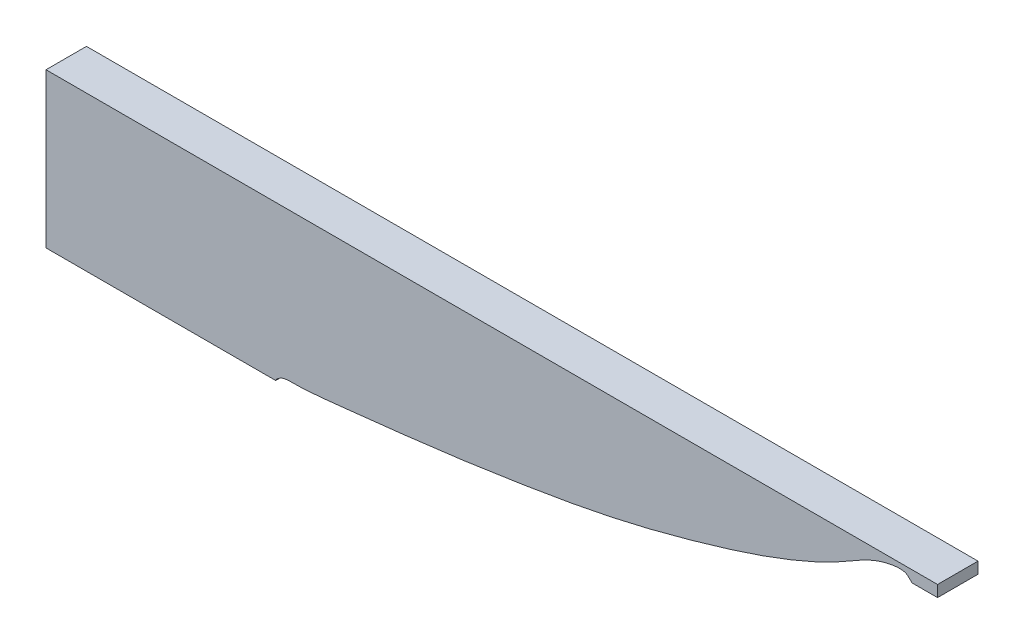
ISO-10303-21;
HEADER;
FILE_DESCRIPTION(('STEP AP214'),'2;1');
FILE_NAME('part.step','',(''),(''),'','','');
FILE_SCHEMA(('AUTOMOTIVE_DESIGN { 1 0 10303 214 1 1 1 1 }'));
ENDSEC;
DATA;
#1=APPLICATION_CONTEXT('core data for automotive mechanical design processes');
#2=APPLICATION_PROTOCOL_DEFINITION('international standard','automotive_design',2000,#1);
#3=PRODUCT_CONTEXT('',#1,'mechanical');
#4=PRODUCT('Part','Part','',(#3));
#5=PRODUCT_RELATED_PRODUCT_CATEGORY('part','',(#4));
#6=PRODUCT_DEFINITION_FORMATION('','',#4);
#7=PRODUCT_DEFINITION_CONTEXT('part definition',#1,'design');
#8=PRODUCT_DEFINITION('design','',#6,#7);
#9=PRODUCT_DEFINITION_SHAPE('','',#8);
#10=(LENGTH_UNIT() NAMED_UNIT(*) SI_UNIT(.MILLI.,.METRE.));
#11=(NAMED_UNIT(*) PLANE_ANGLE_UNIT() SI_UNIT($,.RADIAN.));
#12=(NAMED_UNIT(*) SI_UNIT($,.STERADIAN.) SOLID_ANGLE_UNIT());
#13=UNCERTAINTY_MEASURE_WITH_UNIT(LENGTH_MEASURE(1.E-05),#10,'distance_accuracy_value','');
#14=(GEOMETRIC_REPRESENTATION_CONTEXT(3) GLOBAL_UNCERTAINTY_ASSIGNED_CONTEXT((#13)) GLOBAL_UNIT_ASSIGNED_CONTEXT((#10,
#11,#12)) REPRESENTATION_CONTEXT('',''));
#15=CARTESIAN_POINT('',(0.,0.,0.));
#16=DIRECTION('',(0.,0.,1.));
#17=DIRECTION('',(1.,0.,0.));
#18=AXIS2_PLACEMENT_3D('',#15,#16,#17);
#19=CARTESIAN_POINT('',(78.7770014948803,2.25600000000005,356.));
#20=DIRECTION('',(-1.,0.,0.));
#21=DIRECTION('',(0.,0.,1.));
#22=AXIS2_PLACEMENT_3D('',#19,#20,#21);
#23=PLANE('',#22);
#24=DIRECTION('',(0.,1.,0.));
#25=VECTOR('',#24,1.);
#26=CARTESIAN_POINT('',(78.7770014948803,2.25600000000005,348.));
#27=LINE('',#26,#25);
#28=CARTESIAN_POINT('',(78.7770014948803,0.,348.));
#29=VERTEX_POINT('',#28);
#30=CARTESIAN_POINT('',(78.7770014948803,2.25600000000005,348.));
#31=VERTEX_POINT('',#30);
#32=EDGE_CURVE('E151',#29,#31,#27,.T.);
#33=ORIENTED_EDGE('',*,*,#32,.T.);
#34=DIRECTION('',(0.,0.,-1.));
#35=VECTOR('',#34,1.);
#36=CARTESIAN_POINT('',(78.7770014948803,2.25600000000005,356.));
#37=LINE('',#36,#35);
#38=CARTESIAN_POINT('',(78.7770014948803,2.25600000000005,356.));
#39=VERTEX_POINT('',#38);
#40=EDGE_CURVE('E11',#39,#31,#37,.T.);
#41=ORIENTED_EDGE('',*,*,#40,.F.);
#42=DIRECTION('',(0.,1.,0.));
#43=VECTOR('',#42,1.);
#44=CARTESIAN_POINT('',(78.7770014948803,2.25600000000005,356.));
#45=LINE('',#44,#43);
#46=CARTESIAN_POINT('',(78.7770014948803,0.,356.));
#47=VERTEX_POINT('',#46);
#48=EDGE_CURVE('E205',#47,#39,#45,.T.);
#49=ORIENTED_EDGE('',*,*,#48,.F.);
#50=DIRECTION('',(0.,0.,-1.));
#51=VECTOR('',#50,1.);
#52=CARTESIAN_POINT('',(78.7770014948803,0.,356.));
#53=LINE('',#52,#51);
#54=EDGE_CURVE('E160',#47,#29,#53,.T.);
#55=ORIENTED_EDGE('',*,*,#54,.T.);
#56=EDGE_LOOP('',(#33,#41,#49,#55));
#57=FACE_BOUND('',#56,.T.);
#58=ADVANCED_FACE('F30',(#57),#23,.F.);
#59=CARTESIAN_POINT('',(78.7770014948803,2.25600000000005,356.));
#60=DIRECTION('',(0.,-1.,0.));
#61=DIRECTION('',(1.,0.,0.));
#62=AXIS2_PLACEMENT_3D('',#59,#60,#61);
#63=PLANE('',#62);
#64=DIRECTION('',(-1.,0.,0.));
#65=VECTOR('',#64,1.);
#66=CARTESIAN_POINT('',(78.7770014948803,2.25600000000005,348.));
#67=LINE('',#66,#65);
#68=CARTESIAN_POINT('',(-97.4926258895072,2.25600000000002,348.));
#69=VERTEX_POINT('',#68);
#70=EDGE_CURVE('E157',#31,#69,#67,.T.);
#71=ORIENTED_EDGE('',*,*,#70,.T.);
#72=DIRECTION('',(0.,0.,-1.));
#73=VECTOR('',#72,1.);
#74=CARTESIAN_POINT('',(-97.4926258895072,2.25600000000002,356.));
#75=LINE('',#74,#73);
#76=CARTESIAN_POINT('',(-97.4926258895072,2.25600000000002,356.));
#77=VERTEX_POINT('',#76);
#78=EDGE_CURVE('E39',#77,#69,#75,.T.);
#79=ORIENTED_EDGE('',*,*,#78,.F.);
#80=DIRECTION('',(-1.,0.,0.));
#81=VECTOR('',#80,1.);
#82=CARTESIAN_POINT('',(78.7770014948803,2.25600000000005,356.));
#83=LINE('',#82,#81);
#84=EDGE_CURVE('E86',#39,#77,#83,.T.);
#85=ORIENTED_EDGE('',*,*,#84,.F.);
#86=ORIENTED_EDGE('',*,*,#40,.T.);
#87=EDGE_LOOP('',(#71,#79,#85,#86));
#88=FACE_BOUND('',#87,.T.);
#89=ADVANCED_FACE('F211',(#88),#63,.F.);
#90=CARTESIAN_POINT('',(-97.4926258895072,-28.2587762088678,356.));
#91=DIRECTION('',(1.,0.,0.));
#92=DIRECTION('',(0.,1.,0.));
#93=AXIS2_PLACEMENT_3D('',#90,#91,#92);
#94=PLANE('',#93);
#95=DIRECTION('',(0.,-1.,0.));
#96=VECTOR('',#95,1.);
#97=CARTESIAN_POINT('',(-97.4926258895072,-28.2587762088678,348.));
#98=LINE('',#97,#96);
#99=CARTESIAN_POINT('',(-97.4926258895072,-28.2587762088678,348.));
#100=VERTEX_POINT('',#99);
#101=EDGE_CURVE('E159',#69,#100,#98,.T.);
#102=ORIENTED_EDGE('',*,*,#101,.T.);
#103=DIRECTION('',(0.,0.,-1.));
#104=VECTOR('',#103,1.);
#105=CARTESIAN_POINT('',(-97.4926258895072,-28.2587762088678,356.));
#106=LINE('',#105,#104);
#107=CARTESIAN_POINT('',(-97.4926258895072,-28.2587762088678,356.));
#108=VERTEX_POINT('',#107);
#109=EDGE_CURVE('E113',#108,#100,#106,.T.);
#110=ORIENTED_EDGE('',*,*,#109,.F.);
#111=DIRECTION('',(0.,-1.,0.));
#112=VECTOR('',#111,1.);
#113=CARTESIAN_POINT('',(-97.4926258895072,-28.2587762088678,356.));
#114=LINE('',#113,#112);
#115=EDGE_CURVE('E101',#77,#108,#114,.T.);
#116=ORIENTED_EDGE('',*,*,#115,.F.);
#117=ORIENTED_EDGE('',*,*,#78,.T.);
#118=EDGE_LOOP('',(#102,#110,#116,#117));
#119=FACE_BOUND('',#118,.T.);
#120=ADVANCED_FACE('F208',(#119),#94,.F.);
#121=CARTESIAN_POINT('',(-97.4926258895072,-28.2587762088678,356.));
#122=CARTESIAN_POINT('',(-82.3550295612493,-28.2574203477883,356.));
#123=CARTESIAN_POINT('',(-67.2174332868805,-28.2554506830638,356.));
#124=CARTESIAN_POINT('',(-52.0798370634807,-28.2532117188545,356.));
#125=B_SPLINE_CURVE_WITH_KNOTS('',3,(#121,#122,#123,#124),.UNSPECIFIED.,.F.,.F.,(4,4),(0.,1.),.UNSPECIFIED.);
#126=DIRECTION('',(0.,0.,-1.));
#127=VECTOR('',#126,1.);
#128=SURFACE_OF_LINEAR_EXTRUSION('',#125,#127);
#129=CARTESIAN_POINT('',(-97.4926258895072,-28.2587762088678,348.));
#130=CARTESIAN_POINT('',(-82.3550295612493,-28.2574203477883,348.));
#131=CARTESIAN_POINT('',(-67.2174332868805,-28.2554506830638,348.));
#132=CARTESIAN_POINT('',(-52.0798370634807,-28.2532117188545,348.));
#133=B_SPLINE_CURVE_WITH_KNOTS('',3,(#129,#130,#131,#132),.UNSPECIFIED.,.F.,.F.,(4,4),(0.,1.),.UNSPECIFIED.);
#134=CARTESIAN_POINT('',(-52.0798370634807,-28.2532117188545,348.));
#135=VERTEX_POINT('',#134);
#136=EDGE_CURVE('E111',#100,#135,#133,.T.);
#137=ORIENTED_EDGE('',*,*,#136,.T.);
#138=DIRECTION('',(0.,0.,-1.));
#139=VECTOR('',#138,1.);
#140=CARTESIAN_POINT('',(-52.0798370634807,-28.2532117188545,356.));
#141=LINE('',#140,#139);
#142=CARTESIAN_POINT('',(-52.0798370634807,-28.2532117188545,356.));
#143=VERTEX_POINT('',#142);
#144=EDGE_CURVE('E108',#143,#135,#141,.T.);
#145=ORIENTED_EDGE('',*,*,#144,.F.);
#146=CARTESIAN_POINT('',(-52.0798370634807,-28.2532117188545,356.));
#147=CARTESIAN_POINT('',(-67.2174332868805,-28.2554506830638,356.));
#148=CARTESIAN_POINT('',(-82.3550295612493,-28.2574203477883,356.));
#149=CARTESIAN_POINT('',(-97.4926258895072,-28.2587762088678,356.));
#150=B_SPLINE_CURVE_WITH_KNOTS('',3,(#146,#147,#148,#149),.UNSPECIFIED.,.F.,.F.,(4,4),(0.,1.),.UNSPECIFIED.);
#151=EDGE_CURVE('E93',#108,#143,#150,.F.);
#152=ORIENTED_EDGE('',*,*,#151,.F.);
#153=ORIENTED_EDGE('',*,*,#109,.T.);
#154=EDGE_LOOP('',(#137,#145,#152,#153));
#155=FACE_BOUND('',#154,.T.);
#156=ADVANCED_FACE('F109',(#155),#128,.F.);
#157=CARTESIAN_POINT('',(-52.0798370634807,-28.2532117188545,356.));
#158=CARTESIAN_POINT('',(-52.0592766041661,-28.1645784945812,356.));
#159=CARTESIAN_POINT('',(-52.0145158030634,-28.0849926197674,356.));
#160=CARTESIAN_POINT('',(-51.9048778997584,-27.9425754383136,356.));
#161=CARTESIAN_POINT('',(-51.8420430580992,-27.8782136494394,356.));
#162=CARTESIAN_POINT('',(-51.6425276326001,-27.6958258431196,356.));
#163=CARTESIAN_POINT('',(-51.4980456727508,-27.5877845221663,356.));
#164=CARTESIAN_POINT('',(-51.1978596372491,-27.3900015534943,356.));
#165=CARTESIAN_POINT('',(-51.038649938862,-27.30350026196,356.));
#166=CARTESIAN_POINT('',(-50.7072465959637,-27.1693018670893,356.));
#167=CARTESIAN_POINT('',(-50.5401456492571,-27.1212028721314,356.));
#168=CARTESIAN_POINT('',(-50.036232257222,-27.0123535339671,356.));
#169=CARTESIAN_POINT('',(-49.6970222178277,-26.9841591674836,356.));
#170=CARTESIAN_POINT('',(-49.0166834643668,-26.9538233551747,356.));
#171=CARTESIAN_POINT('',(-48.6753298390258,-26.9547358901385,356.));
#172=CARTESIAN_POINT('',(-47.9924650418816,-26.958700220849,356.));
#173=CARTESIAN_POINT('',(-47.6511240939378,-26.9594406144764,356.));
#174=CARTESIAN_POINT('',(-46.9695342381426,-26.9460930234256,356.));
#175=CARTESIAN_POINT('',(-46.629157975807,-26.9337343346613,356.));
#176=CARTESIAN_POINT('',(-45.6091308773047,-26.8816988781144,356.));
#177=CARTESIAN_POINT('',(-44.9305647912852,-26.8260860066659,356.));
#178=CARTESIAN_POINT('',(-43.5751997232413,-26.697534032535,356.));
#179=CARTESIAN_POINT('',(-42.8981749418611,-26.6268608864918,356.));
#180=CARTESIAN_POINT('',(-41.5439567574236,-26.4871545721202,356.));
#181=CARTESIAN_POINT('',(-40.8669194490542,-26.4166032608464,356.));
#182=CARTESIAN_POINT('',(-38.8362254847579,-26.2008843311705,356.));
#183=CARTESIAN_POINT('',(-37.4829388155762,-26.0521390424067,356.));
#184=CARTESIAN_POINT('',(-30.7163400425703,-25.310394796677,356.));
#185=CARTESIAN_POINT('',(-25.3034163748986,-24.7114436640146,356.));
#186=CARTESIAN_POINT('',(-17.1995570163137,-23.6861760007202,356.));
#187=CARTESIAN_POINT('',(-14.5010484010931,-23.3228641025236,356.));
#188=CARTESIAN_POINT('',(-9.11090947916087,-22.5513642563571,356.));
#189=CARTESIAN_POINT('',(-6.4189927055765,-22.1440986172336,356.));
#190=CARTESIAN_POINT('',(-1.04032048968618,-21.2943435046088,356.));
#191=CARTESIAN_POINT('',(1.64652824247117,-20.8527741141081,356.));
#192=CARTESIAN_POINT('',(7.00906511111329,-19.9115816682843,356.));
#193=CARTESIAN_POINT('',(9.68485143297551,-19.4112778093873,356.));
#194=CARTESIAN_POINT('',(15.01901194664,-18.3163135410075,356.));
#195=CARTESIAN_POINT('',(17.6767521154746,-17.7200985941471,356.));
#196=CARTESIAN_POINT('',(22.9671578000031,-16.4364222059472,356.));
#197=CARTESIAN_POINT('',(25.601300046947,-15.7506424914263,356.));
#198=CARTESIAN_POINT('',(30.8527854245381,-14.312343552401,356.));
#199=CARTESIAN_POINT('',(33.4701427990933,-13.5597340982063,356.));
#200=CARTESIAN_POINT('',(38.6793515379877,-11.972971220532,356.));
#201=CARTESIAN_POINT('',(41.2723631270859,-11.1401476965787,356.));
#202=CARTESIAN_POINT('',(45.1290333962427,-9.79731807194106,356.));
#203=CARTESIAN_POINT('',(46.4097857397881,-9.33327046378534,356.));
#204=CARTESIAN_POINT('',(48.9527112595196,-8.36364321241708,356.));
#205=CARTESIAN_POINT('',(50.2142933620074,-7.85750451206132,356.));
#206=CARTESIAN_POINT('',(52.7184916323724,-6.80429360294811,356.));
#207=CARTESIAN_POINT('',(53.9614013071833,-6.2578548598642,356.));
#208=CARTESIAN_POINT('',(56.4218559290244,-5.11023357545852,356.));
#209=CARTESIAN_POINT('',(57.6390705514613,-4.50833810620645,356.));
#210=CARTESIAN_POINT('',(59.4364546094969,-3.54411843739262,356.));
#211=CARTESIAN_POINT('',(60.0310197207187,-3.2128639172937,356.));
#212=CARTESIAN_POINT('',(61.2153076362572,-2.53990389672216,356.));
#213=CARTESIAN_POINT('',(61.8042741280015,-2.19654755242903,356.));
#214=CARTESIAN_POINT('',(63.5760527594509,-1.17714130497712,356.));
#215=CARTESIAN_POINT('',(64.7649318279982,-0.514440223075028,356.));
#216=CARTESIAN_POINT('',(66.6428210226451,0.2718290945534,356.));
#217=CARTESIAN_POINT('',(67.2851425403943,0.497977492711653,356.));
#218=CARTESIAN_POINT('',(68.2739204826109,0.781622646606468,356.));
#219=CARTESIAN_POINT('',(68.6085473707875,0.867364813986191,356.));
#220=CARTESIAN_POINT('',(69.2796175764235,1.01697053898446,356.));
#221=CARTESIAN_POINT('',(69.6166272151628,1.08073374910444,356.));
#222=CARTESIAN_POINT('',(70.2939698517954,1.18337862575997,356.));
#223=CARTESIAN_POINT('',(70.6342604516534,1.22257772069109,356.));
#224=CARTESIAN_POINT('',(71.1497939330867,1.24321145402293,356.));
#225=CARTESIAN_POINT('',(71.3224532729503,1.24398872219038,356.));
#226=CARTESIAN_POINT('',(71.6697875262608,1.23045292984488,356.));
#227=CARTESIAN_POINT('',(71.8422175005116,1.2155457401816,356.));
#228=CARTESIAN_POINT('',(72.1822080111937,1.15663088404132,356.));
#229=CARTESIAN_POINT('',(72.3524970549208,1.11101871988936,356.));
#230=CARTESIAN_POINT('',(72.6694046502051,0.971361584738933,356.));
#231=CARTESIAN_POINT('',(72.8126175194336,0.874577949535413,356.));
#232=CARTESIAN_POINT('',(73.0818390824582,0.65282626720113,356.));
#233=CARTESIAN_POINT('',(73.2045163170262,0.529473718012165,356.));
#234=CARTESIAN_POINT('',(73.3939378046617,0.350096570101679,356.));
#235=CARTESIAN_POINT('',(73.457258895039,0.290493001808365,356.));
#236=CARTESIAN_POINT('',(73.5718397171489,0.158675528089049,356.));
#237=CARTESIAN_POINT('',(73.6201119787932,0.0847028822426885,356.));
#238=CARTESIAN_POINT('',(73.6434830309088,0.,356.));
#239=B_SPLINE_CURVE_WITH_KNOTS('',3,(#157,#158,#159,#160,#161,#162,#163,#164,#165,#166,#167,
#168,#169,#170,#171,#172,#173,#174,#175,#176,#177,#178,#179,#180,#181,#182,#183,#184,#185,#186,
#187,#188,#189,#190,#191,#192,#193,#194,#195,#196,#197,#198,#199,#200,#201,#202,#203,#204,#205,
#206,#207,#208,#209,#210,#211,#212,#213,#214,#215,#216,#217,#218,#219,#220,#221,#222,#223,#224,
#225,#226,#227,#228,#229,#230,#231,#232,#233,#234,#235,#236,#237,#238),.UNSPECIFIED.,.F.,.F.,(4,
2,2,2,2,2,2,2,2,2,2,2,2,2,2,2,2,2,2,2,2,2,2,2,2,2,2,2,2,2,2,2,2,2,2,2,2,2,2,2,4),(0.,
0.001953125,0.00390625,0.00781249999999989,0.0117187499999999,0.0156249999999998,
0.0234374999999999,0.0312499999999999,0.0390624999999999,0.0468749999999999,0.0624999999999999,
0.0781249999999998,0.0937499999999998,0.125,0.25,0.3125,0.375,0.4375,0.5,0.5625,0.625,0.6875,
0.75,0.78125,0.8125,0.84375,0.875,0.890625,0.90625,0.9375,0.953125000000001,0.9609375,0.96875,
0.9765625,0.98046875,0.984375,0.98828125,0.9921875,0.99609375,0.998046875,1.),.UNSPECIFIED.);
#240=DIRECTION('',(0.,0.,-1.));
#241=VECTOR('',#240,1.);
#242=SURFACE_OF_LINEAR_EXTRUSION('',#239,#241);
#243=CARTESIAN_POINT('',(-52.0798370634807,-28.2532117188545,348.));
#244=CARTESIAN_POINT('',(-52.0592766041661,-28.1645784945812,348.));
#245=CARTESIAN_POINT('',(-52.0145158030634,-28.0849926197674,348.));
#246=CARTESIAN_POINT('',(-51.9048778997584,-27.9425754383136,348.));
#247=CARTESIAN_POINT('',(-51.8420430580992,-27.8782136494394,348.));
#248=CARTESIAN_POINT('',(-51.6425276326001,-27.6958258431196,348.));
#249=CARTESIAN_POINT('',(-51.4980456727508,-27.5877845221663,348.));
#250=CARTESIAN_POINT('',(-51.1978596372491,-27.3900015534943,348.));
#251=CARTESIAN_POINT('',(-51.038649938862,-27.30350026196,348.));
#252=CARTESIAN_POINT('',(-50.7072465959637,-27.1693018670893,348.));
#253=CARTESIAN_POINT('',(-50.5401456492571,-27.1212028721314,348.));
#254=CARTESIAN_POINT('',(-50.036232257222,-27.0123535339671,348.));
#255=CARTESIAN_POINT('',(-49.6970222178277,-26.9841591674836,348.));
#256=CARTESIAN_POINT('',(-49.0166834643668,-26.9538233551747,348.));
#257=CARTESIAN_POINT('',(-48.6753298390258,-26.9547358901385,348.));
#258=CARTESIAN_POINT('',(-47.9924650418816,-26.958700220849,348.));
#259=CARTESIAN_POINT('',(-47.6511240939378,-26.9594406144764,348.));
#260=CARTESIAN_POINT('',(-46.9695342381426,-26.9460930234256,348.));
#261=CARTESIAN_POINT('',(-46.629157975807,-26.9337343346613,348.));
#262=CARTESIAN_POINT('',(-45.6091308773047,-26.8816988781144,348.));
#263=CARTESIAN_POINT('',(-44.9305647912852,-26.8260860066659,348.));
#264=CARTESIAN_POINT('',(-43.5751997232413,-26.697534032535,348.));
#265=CARTESIAN_POINT('',(-42.8981749418611,-26.6268608864918,348.));
#266=CARTESIAN_POINT('',(-41.5439567574236,-26.4871545721202,348.));
#267=CARTESIAN_POINT('',(-40.8669194490542,-26.4166032608464,348.));
#268=CARTESIAN_POINT('',(-38.8362254847579,-26.2008843311705,348.));
#269=CARTESIAN_POINT('',(-37.4829388155762,-26.0521390424067,348.));
#270=CARTESIAN_POINT('',(-30.7163400425703,-25.310394796677,348.));
#271=CARTESIAN_POINT('',(-25.3034163748986,-24.7114436640146,348.));
#272=CARTESIAN_POINT('',(-17.1995570163137,-23.6861760007202,348.));
#273=CARTESIAN_POINT('',(-14.5010484010931,-23.3228641025236,348.));
#274=CARTESIAN_POINT('',(-9.11090947916087,-22.5513642563571,348.));
#275=CARTESIAN_POINT('',(-6.4189927055765,-22.1440986172336,348.));
#276=CARTESIAN_POINT('',(-1.04032048968618,-21.2943435046088,348.));
#277=CARTESIAN_POINT('',(1.64652824247117,-20.8527741141081,348.));
#278=CARTESIAN_POINT('',(7.00906511111329,-19.9115816682843,348.));
#279=CARTESIAN_POINT('',(9.68485143297551,-19.4112778093873,348.));
#280=CARTESIAN_POINT('',(15.01901194664,-18.3163135410075,348.));
#281=CARTESIAN_POINT('',(17.6767521154746,-17.7200985941471,348.));
#282=CARTESIAN_POINT('',(22.9671578000031,-16.4364222059472,348.));
#283=CARTESIAN_POINT('',(25.601300046947,-15.7506424914263,348.));
#284=CARTESIAN_POINT('',(30.8527854245381,-14.312343552401,348.));
#285=CARTESIAN_POINT('',(33.4701427990933,-13.5597340982063,348.));
#286=CARTESIAN_POINT('',(38.6793515379877,-11.972971220532,348.));
#287=CARTESIAN_POINT('',(41.2723631270859,-11.1401476965787,348.));
#288=CARTESIAN_POINT('',(45.1290333962427,-9.79731807194106,348.));
#289=CARTESIAN_POINT('',(46.4097857397881,-9.33327046378534,348.));
#290=CARTESIAN_POINT('',(48.9527112595196,-8.36364321241708,348.));
#291=CARTESIAN_POINT('',(50.2142933620074,-7.85750451206132,348.));
#292=CARTESIAN_POINT('',(52.7184916323724,-6.80429360294811,348.));
#293=CARTESIAN_POINT('',(53.9614013071833,-6.2578548598642,348.));
#294=CARTESIAN_POINT('',(56.4218559290244,-5.11023357545852,348.));
#295=CARTESIAN_POINT('',(57.6390705514613,-4.50833810620645,348.));
#296=CARTESIAN_POINT('',(59.4364546094969,-3.54411843739262,348.));
#297=CARTESIAN_POINT('',(60.0310197207187,-3.2128639172937,348.));
#298=CARTESIAN_POINT('',(61.2153076362572,-2.53990389672216,348.));
#299=CARTESIAN_POINT('',(61.8042741280015,-2.19654755242903,348.));
#300=CARTESIAN_POINT('',(63.5760527594509,-1.17714130497712,348.));
#301=CARTESIAN_POINT('',(64.7649318279982,-0.514440223075028,348.));
#302=CARTESIAN_POINT('',(66.6428210226451,0.2718290945534,348.));
#303=CARTESIAN_POINT('',(67.2851425403943,0.497977492711653,348.));
#304=CARTESIAN_POINT('',(68.2739204826109,0.781622646606468,348.));
#305=CARTESIAN_POINT('',(68.6085473707875,0.867364813986191,348.));
#306=CARTESIAN_POINT('',(69.2796175764235,1.01697053898446,348.));
#307=CARTESIAN_POINT('',(69.6166272151628,1.08073374910444,348.));
#308=CARTESIAN_POINT('',(70.2939698517954,1.18337862575997,348.));
#309=CARTESIAN_POINT('',(70.6342604516534,1.22257772069109,348.));
#310=CARTESIAN_POINT('',(71.1497939330867,1.24321145402293,348.));
#311=CARTESIAN_POINT('',(71.3224532729503,1.24398872219038,348.));
#312=CARTESIAN_POINT('',(71.6697875262608,1.23045292984488,348.));
#313=CARTESIAN_POINT('',(71.8422175005116,1.2155457401816,348.));
#314=CARTESIAN_POINT('',(72.1822080111937,1.15663088404132,348.));
#315=CARTESIAN_POINT('',(72.3524970549208,1.11101871988936,348.));
#316=CARTESIAN_POINT('',(72.6694046502051,0.971361584738933,348.));
#317=CARTESIAN_POINT('',(72.8126175194336,0.874577949535413,348.));
#318=CARTESIAN_POINT('',(73.0818390824582,0.65282626720113,348.));
#319=CARTESIAN_POINT('',(73.2045163170262,0.529473718012165,348.));
#320=CARTESIAN_POINT('',(73.3939378046617,0.350096570101679,348.));
#321=CARTESIAN_POINT('',(73.457258895039,0.290493001808365,348.));
#322=CARTESIAN_POINT('',(73.5718397171489,0.158675528089049,348.));
#323=CARTESIAN_POINT('',(73.6201119787932,0.0847028822426885,348.));
#324=CARTESIAN_POINT('',(73.6434830309088,0.,348.));
#325=B_SPLINE_CURVE_WITH_KNOTS('',3,(#243,#244,#245,#246,#247,#248,#249,#250,#251,#252,#253,
#254,#255,#256,#257,#258,#259,#260,#261,#262,#263,#264,#265,#266,#267,#268,#269,#270,#271,#272,
#273,#274,#275,#276,#277,#278,#279,#280,#281,#282,#283,#284,#285,#286,#287,#288,#289,#290,#291,
#292,#293,#294,#295,#296,#297,#298,#299,#300,#301,#302,#303,#304,#305,#306,#307,#308,#309,#310,
#311,#312,#313,#314,#315,#316,#317,#318,#319,#320,#321,#322,#323,#324),.UNSPECIFIED.,.F.,.F.,(4,
2,2,2,2,2,2,2,2,2,2,2,2,2,2,2,2,2,2,2,2,2,2,2,2,2,2,2,2,2,2,2,2,2,2,2,2,2,2,2,4),(0.,
0.001953125,0.00390625,0.00781249999999989,0.0117187499999999,0.0156249999999998,
0.0234374999999999,0.0312499999999999,0.0390624999999999,0.0468749999999999,0.0624999999999999,
0.0781249999999998,0.0937499999999998,0.125,0.25,0.3125,0.375,0.4375,0.5,0.5625,0.625,0.6875,
0.75,0.78125,0.8125,0.84375,0.875,0.890625,0.90625,0.9375,0.953125000000001,0.9609375,0.96875,
0.9765625,0.98046875,0.984375,0.98828125,0.9921875,0.99609375,0.998046875,1.),.UNSPECIFIED.);
#326=CARTESIAN_POINT('',(73.6434830309088,0.,348.));
#327=VERTEX_POINT('',#326);
#328=EDGE_CURVE('E71',#135,#327,#325,.T.);
#329=ORIENTED_EDGE('',*,*,#328,.T.);
#330=DIRECTION('',(0.,0.,-1.));
#331=VECTOR('',#330,1.);
#332=CARTESIAN_POINT('',(73.6434830309088,0.,356.));
#333=LINE('',#332,#331);
#334=CARTESIAN_POINT('',(73.6434830309088,0.,356.));
#335=VERTEX_POINT('',#334);
#336=EDGE_CURVE('E114',#335,#327,#333,.T.);
#337=ORIENTED_EDGE('',*,*,#336,.F.);
#338=CARTESIAN_POINT('',(73.6434830309088,0.,356.));
#339=CARTESIAN_POINT('',(73.6201119787932,0.0847028822426885,356.));
#340=CARTESIAN_POINT('',(73.5718397171489,0.158675528089049,356.));
#341=CARTESIAN_POINT('',(73.457258895039,0.290493001808365,356.));
#342=CARTESIAN_POINT('',(73.3939378046617,0.350096570101679,356.));
#343=CARTESIAN_POINT('',(73.2045163170262,0.529473718012165,356.));
#344=CARTESIAN_POINT('',(73.0818390824582,0.65282626720113,356.));
#345=CARTESIAN_POINT('',(72.8126175194336,0.874577949535413,356.));
#346=CARTESIAN_POINT('',(72.6694046502051,0.971361584738933,356.));
#347=CARTESIAN_POINT('',(72.3524970549208,1.11101871988936,356.));
#348=CARTESIAN_POINT('',(72.1822080111937,1.15663088404132,356.));
#349=CARTESIAN_POINT('',(71.8422175005116,1.2155457401816,356.));
#350=CARTESIAN_POINT('',(71.6697875262608,1.23045292984488,356.));
#351=CARTESIAN_POINT('',(71.3224532729503,1.24398872219038,356.));
#352=CARTESIAN_POINT('',(71.1497939330867,1.24321145402293,356.));
#353=CARTESIAN_POINT('',(70.6342604516534,1.22257772069109,356.));
#354=CARTESIAN_POINT('',(70.2939698517954,1.18337862575997,356.));
#355=CARTESIAN_POINT('',(69.6166272151628,1.08073374910444,356.));
#356=CARTESIAN_POINT('',(69.2796175764235,1.01697053898446,356.));
#357=CARTESIAN_POINT('',(68.6085473707875,0.867364813986191,356.));
#358=CARTESIAN_POINT('',(68.2739204826109,0.781622646606468,356.));
#359=CARTESIAN_POINT('',(67.2851425403943,0.497977492711653,356.));
#360=CARTESIAN_POINT('',(66.6428210226451,0.2718290945534,356.));
#361=CARTESIAN_POINT('',(64.7649318279982,-0.514440223075028,356.));
#362=CARTESIAN_POINT('',(63.5760527594509,-1.17714130497712,356.));
#363=CARTESIAN_POINT('',(61.8042741280015,-2.19654755242903,356.));
#364=CARTESIAN_POINT('',(61.2153076362572,-2.53990389672216,356.));
#365=CARTESIAN_POINT('',(60.0310197207187,-3.2128639172937,356.));
#366=CARTESIAN_POINT('',(59.4364546094969,-3.54411843739262,356.));
#367=CARTESIAN_POINT('',(57.6390705514613,-4.50833810620645,356.));
#368=CARTESIAN_POINT('',(56.4218559290244,-5.11023357545852,356.));
#369=CARTESIAN_POINT('',(53.9614013071833,-6.2578548598642,356.));
#370=CARTESIAN_POINT('',(52.7184916323724,-6.80429360294811,356.));
#371=CARTESIAN_POINT('',(50.2142933620074,-7.85750451206132,356.));
#372=CARTESIAN_POINT('',(48.9527112595196,-8.36364321241708,356.));
#373=CARTESIAN_POINT('',(46.4097857397881,-9.33327046378534,356.));
#374=CARTESIAN_POINT('',(45.1290333962427,-9.79731807194106,356.));
#375=CARTESIAN_POINT('',(41.2723631270859,-11.1401476965787,356.));
#376=CARTESIAN_POINT('',(38.6793515379877,-11.972971220532,356.));
#377=CARTESIAN_POINT('',(33.4701427990933,-13.5597340982063,356.));
#378=CARTESIAN_POINT('',(30.8527854245381,-14.312343552401,356.));
#379=CARTESIAN_POINT('',(25.601300046947,-15.7506424914263,356.));
#380=CARTESIAN_POINT('',(22.9671578000031,-16.4364222059472,356.));
#381=CARTESIAN_POINT('',(17.6767521154746,-17.7200985941471,356.));
#382=CARTESIAN_POINT('',(15.01901194664,-18.3163135410075,356.));
#383=CARTESIAN_POINT('',(9.68485143297551,-19.4112778093873,356.));
#384=CARTESIAN_POINT('',(7.00906511111329,-19.9115816682843,356.));
#385=CARTESIAN_POINT('',(1.64652824247117,-20.8527741141081,356.));
#386=CARTESIAN_POINT('',(-1.04032048968618,-21.2943435046088,356.));
#387=CARTESIAN_POINT('',(-6.4189927055765,-22.1440986172336,356.));
#388=CARTESIAN_POINT('',(-9.11090947916087,-22.5513642563571,356.));
#389=CARTESIAN_POINT('',(-14.5010484010931,-23.3228641025236,356.));
#390=CARTESIAN_POINT('',(-17.1995570163137,-23.6861760007202,356.));
#391=CARTESIAN_POINT('',(-25.3034163748986,-24.7114436640146,356.));
#392=CARTESIAN_POINT('',(-30.7163400425703,-25.310394796677,356.));
#393=CARTESIAN_POINT('',(-37.4829388155762,-26.0521390424067,356.));
#394=CARTESIAN_POINT('',(-38.8362254847579,-26.2008843311705,356.));
#395=CARTESIAN_POINT('',(-40.8669194490542,-26.4166032608464,356.));
#396=CARTESIAN_POINT('',(-41.5439567574236,-26.4871545721202,356.));
#397=CARTESIAN_POINT('',(-42.8981749418611,-26.6268608864918,356.));
#398=CARTESIAN_POINT('',(-43.5751997232413,-26.697534032535,356.));
#399=CARTESIAN_POINT('',(-44.9305647912852,-26.8260860066659,356.));
#400=CARTESIAN_POINT('',(-45.6091308773047,-26.8816988781144,356.));
#401=CARTESIAN_POINT('',(-46.629157975807,-26.9337343346613,356.));
#402=CARTESIAN_POINT('',(-46.9695342381426,-26.9460930234256,356.));
#403=CARTESIAN_POINT('',(-47.6511240939378,-26.9594406144764,356.));
#404=CARTESIAN_POINT('',(-47.9924650418816,-26.958700220849,356.));
#405=CARTESIAN_POINT('',(-48.6753298390258,-26.9547358901385,356.));
#406=CARTESIAN_POINT('',(-49.0166834643668,-26.9538233551747,356.));
#407=CARTESIAN_POINT('',(-49.6970222178277,-26.9841591674836,356.));
#408=CARTESIAN_POINT('',(-50.036232257222,-27.0123535339671,356.));
#409=CARTESIAN_POINT('',(-50.5401456492571,-27.1212028721314,356.));
#410=CARTESIAN_POINT('',(-50.7072465959637,-27.1693018670893,356.));
#411=CARTESIAN_POINT('',(-51.038649938862,-27.30350026196,356.));
#412=CARTESIAN_POINT('',(-51.1978596372491,-27.3900015534943,356.));
#413=CARTESIAN_POINT('',(-51.4980456727508,-27.5877845221663,356.));
#414=CARTESIAN_POINT('',(-51.6425276326001,-27.6958258431196,356.));
#415=CARTESIAN_POINT('',(-51.8420430580992,-27.8782136494394,356.));
#416=CARTESIAN_POINT('',(-51.9048778997584,-27.9425754383136,356.));
#417=CARTESIAN_POINT('',(-52.0145158030634,-28.0849926197674,356.));
#418=CARTESIAN_POINT('',(-52.0592766041661,-28.1645784945812,356.));
#419=CARTESIAN_POINT('',(-52.0798370634807,-28.2532117188545,356.));
#420=B_SPLINE_CURVE_WITH_KNOTS('',3,(#338,#339,#340,#341,#342,#343,#344,#345,#346,#347,#348,
#349,#350,#351,#352,#353,#354,#355,#356,#357,#358,#359,#360,#361,#362,#363,#364,#365,#366,#367,
#368,#369,#370,#371,#372,#373,#374,#375,#376,#377,#378,#379,#380,#381,#382,#383,#384,#385,#386,
#387,#388,#389,#390,#391,#392,#393,#394,#395,#396,#397,#398,#399,#400,#401,#402,#403,#404,#405,
#406,#407,#408,#409,#410,#411,#412,#413,#414,#415,#416,#417,#418,#419),.UNSPECIFIED.,.F.,.F.,(4,
2,2,2,2,2,2,2,2,2,2,2,2,2,2,2,2,2,2,2,2,2,2,2,2,2,2,2,2,2,2,2,2,2,2,2,2,2,2,2,4),(0.,
0.001953125,0.00390625,0.00781249999999989,0.0117187499999999,0.0156249999999998,
0.0195312499999998,0.0234374999999998,0.0312499999999997,0.0390624999999996,0.0468749999999994,
0.0624999999999997,0.0937499999999996,0.109375,0.125,0.15625,0.1875,0.21875,0.25,0.3125,0.375,
0.4375,0.5,0.5625,0.625,0.6875,0.75,0.875,0.90625,0.921875,0.9375,0.953125,0.9609375,0.96875,
0.9765625,0.984375,0.98828125,0.9921875,0.99609375,0.998046875,1.),.UNSPECIFIED.);
#421=EDGE_CURVE('E98',#143,#335,#420,.F.);
#422=ORIENTED_EDGE('',*,*,#421,.F.);
#423=ORIENTED_EDGE('',*,*,#144,.T.);
#424=EDGE_LOOP('',(#329,#337,#422,#423));
#425=FACE_BOUND('',#424,.T.);
#426=ADVANCED_FACE('F117',(#425),#242,.F.);
#427=CARTESIAN_POINT('',(73.6434830309088,0.,356.));
#428=DIRECTION('',(0.,1.,0.));
#429=DIRECTION('',(-1.,0.,0.));
#430=AXIS2_PLACEMENT_3D('',#427,#428,#429);
#431=PLANE('',#430);
#432=DIRECTION('',(1.,0.,0.));
#433=VECTOR('',#432,1.);
#434=CARTESIAN_POINT('',(73.6434830309088,0.,348.));
#435=LINE('',#434,#433);
#436=EDGE_CURVE('E78',#327,#29,#435,.T.);
#437=ORIENTED_EDGE('',*,*,#436,.T.);
#438=ORIENTED_EDGE('',*,*,#54,.F.);
#439=DIRECTION('',(1.,0.,0.));
#440=VECTOR('',#439,1.);
#441=CARTESIAN_POINT('',(73.6434830309088,0.,356.));
#442=LINE('',#441,#440);
#443=EDGE_CURVE('E48',#335,#47,#442,.T.);
#444=ORIENTED_EDGE('',*,*,#443,.F.);
#445=ORIENTED_EDGE('',*,*,#336,.T.);
#446=EDGE_LOOP('',(#437,#438,#444,#445));
#447=FACE_BOUND('',#446,.T.);
#448=ADVANCED_FACE('F137',(#447),#431,.F.);
#449=CARTESIAN_POINT('',(12.3519316898078,-18.8637956751974,356.));
#450=DIRECTION('',(0.,0.,-1.));
#451=DIRECTION('',(-1.,0.,0.));
#452=AXIS2_PLACEMENT_3D('',#449,#450,#451);
#453=PLANE('',#452);
#454=ORIENTED_EDGE('',*,*,#48,.T.);
#455=ORIENTED_EDGE('',*,*,#84,.T.);
#456=ORIENTED_EDGE('',*,*,#115,.T.);
#457=ORIENTED_EDGE('',*,*,#151,.T.);
#458=ORIENTED_EDGE('',*,*,#421,.T.);
#459=ORIENTED_EDGE('',*,*,#443,.T.);
#460=EDGE_LOOP('',(#454,#455,#456,#457,#458,#459));
#461=FACE_BOUND('',#460,.T.);
#462=ADVANCED_FACE('F96',(#461),#453,.F.);
#463=CARTESIAN_POINT('',(12.3519316898078,-18.8637956751974,348.));
#464=DIRECTION('',(0.,0.,-1.));
#465=DIRECTION('',(-1.,0.,0.));
#466=AXIS2_PLACEMENT_3D('',#463,#464,#465);
#467=PLANE('',#466);
#468=ORIENTED_EDGE('',*,*,#32,.F.);
#469=ORIENTED_EDGE('',*,*,#436,.F.);
#470=ORIENTED_EDGE('',*,*,#328,.F.);
#471=ORIENTED_EDGE('',*,*,#136,.F.);
#472=ORIENTED_EDGE('',*,*,#101,.F.);
#473=ORIENTED_EDGE('',*,*,#70,.F.);
#474=EDGE_LOOP('',(#468,#469,#470,#471,#472,#473));
#475=FACE_BOUND('',#474,.T.);
#476=ADVANCED_FACE('F184',(#475),#467,.T.);
#477=CLOSED_SHELL('',(#58,#89,#120,#156,#426,#448,#462,#476));
#478=MANIFOLD_SOLID_BREP('B2',#477);
#479=ADVANCED_BREP_SHAPE_REPRESENTATION('',(#18,#478),#14);
#480=SHAPE_DEFINITION_REPRESENTATION(#9,#479);
ENDSEC;
END-ISO-10303-21;
